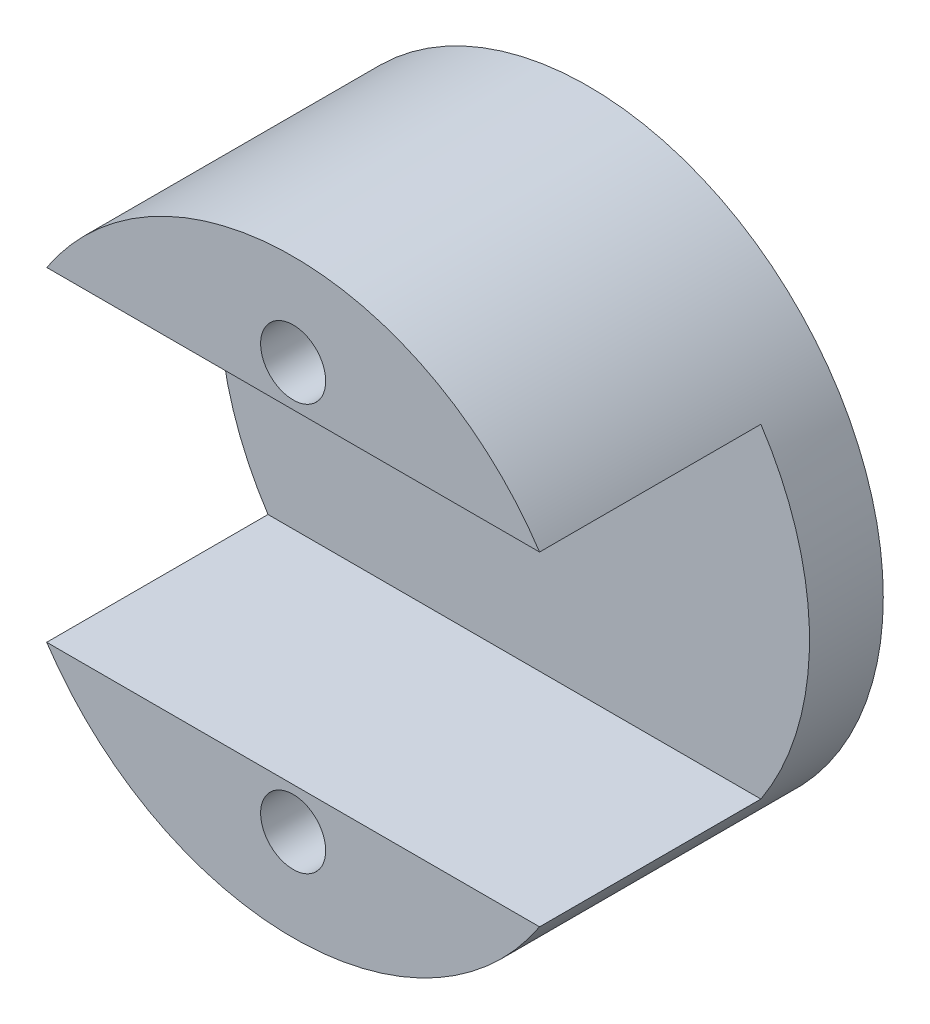
ISO-10303-21;
HEADER;
FILE_DESCRIPTION(('STEP AP214'),'2;1');
FILE_NAME('part.step','',(''),(''),'','','');
FILE_SCHEMA(('AUTOMOTIVE_DESIGN { 1 0 10303 214 1 1 1 1 }'));
ENDSEC;
DATA;
#1=APPLICATION_CONTEXT('core data for automotive mechanical design processes');
#2=APPLICATION_PROTOCOL_DEFINITION('international standard','automotive_design',2000,#1);
#3=PRODUCT_CONTEXT('',#1,'mechanical');
#4=PRODUCT('Part','Part','',(#3));
#5=PRODUCT_RELATED_PRODUCT_CATEGORY('part','',(#4));
#6=PRODUCT_DEFINITION_FORMATION('','',#4);
#7=PRODUCT_DEFINITION_CONTEXT('part definition',#1,'design');
#8=PRODUCT_DEFINITION('design','',#6,#7);
#9=PRODUCT_DEFINITION_SHAPE('','',#8);
#10=(LENGTH_UNIT() NAMED_UNIT(*) SI_UNIT(.MILLI.,.METRE.));
#11=(NAMED_UNIT(*) PLANE_ANGLE_UNIT() SI_UNIT($,.RADIAN.));
#12=(NAMED_UNIT(*) SI_UNIT($,.STERADIAN.) SOLID_ANGLE_UNIT());
#13=UNCERTAINTY_MEASURE_WITH_UNIT(LENGTH_MEASURE(1.E-05),#10,'distance_accuracy_value','');
#14=(GEOMETRIC_REPRESENTATION_CONTEXT(3) GLOBAL_UNCERTAINTY_ASSIGNED_CONTEXT((#13)) GLOBAL_UNIT_ASSIGNED_CONTEXT((#10,
#11,#12)) REPRESENTATION_CONTEXT('',''));
#15=CARTESIAN_POINT('',(0.,0.,0.));
#16=DIRECTION('',(0.,0.,1.));
#17=DIRECTION('',(1.,0.,0.));
#18=AXIS2_PLACEMENT_3D('',#15,#16,#17);
#19=CARTESIAN_POINT('',(0.,0.,25.4));
#20=DIRECTION('',(0.,0.,1.));
#21=DIRECTION('',(1.,0.,0.));
#22=AXIS2_PLACEMENT_3D('',#19,#20,#21);
#23=PLANE('',#22);
#24=CARTESIAN_POINT('',(0.,17.5,25.4));
#25=DIRECTION('',(0.,0.,1.));
#26=DIRECTION('',(1.,0.,0.));
#27=AXIS2_PLACEMENT_3D('',#24,#25,#26);
#28=CIRCLE('',#27,2.8);
#29=CARTESIAN_POINT('',(2.80000000000001,17.5,25.4));
#30=VERTEX_POINT('',#29);
#31=EDGE_CURVE('E138',#30,#30,#28,.T.);
#32=ORIENTED_EDGE('',*,*,#31,.F.);
#33=EDGE_LOOP('',(#32));
#34=FACE_BOUND('',#33,.T.);
#35=DIRECTION('',(-1.,0.,0.));
#36=VECTOR('',#35,1.);
#37=CARTESIAN_POINT('',(0.,13.97,25.4));
#38=LINE('',#37,#36);
#39=CARTESIAN_POINT('',(21.2131822223824,13.97,25.4));
#40=VERTEX_POINT('',#39);
#41=CARTESIAN_POINT('',(-21.2131822223824,13.97,25.4));
#42=VERTEX_POINT('',#41);
#43=EDGE_CURVE('E88',#40,#42,#38,.T.);
#44=ORIENTED_EDGE('',*,*,#43,.F.);
#45=CARTESIAN_POINT('',(0.,0.,25.4));
#46=DIRECTION('',(0.,0.,1.));
#47=DIRECTION('',(1.,0.,0.));
#48=AXIS2_PLACEMENT_3D('',#45,#46,#47);
#49=CIRCLE('',#48,25.4);
#50=EDGE_CURVE('E89',#40,#42,#49,.T.);
#51=ORIENTED_EDGE('',*,*,#50,.T.);
#52=EDGE_LOOP('',(#44,#51));
#53=FACE_BOUND('',#52,.T.);
#54=ADVANCED_FACE('F39',(#34,#53),#23,.T.);
#55=CARTESIAN_POINT('',(0.,0.,25.4));
#56=DIRECTION('',(0.,0.,-1.));
#57=DIRECTION('',(-1.,0.,0.));
#58=AXIS2_PLACEMENT_3D('',#55,#56,#57);
#59=CYLINDRICAL_SURFACE('',#58,25.4);
#60=CARTESIAN_POINT('',(0.,0.,6.35));
#61=DIRECTION('',(0.,0.,1.));
#62=DIRECTION('',(1.,0.,0.));
#63=AXIS2_PLACEMENT_3D('',#60,#61,#62);
#64=CIRCLE('',#63,25.4);
#65=CARTESIAN_POINT('',(-21.2131822223824,13.97,6.35));
#66=VERTEX_POINT('',#65);
#67=CARTESIAN_POINT('',(-21.2131822223824,-13.97,6.35));
#68=VERTEX_POINT('',#67);
#69=EDGE_CURVE('E11',#66,#68,#64,.T.);
#70=ORIENTED_EDGE('',*,*,#69,.F.);
#71=DIRECTION('',(0.,0.,-1.));
#72=VECTOR('',#71,1.);
#73=CARTESIAN_POINT('',(-21.2131822223824,13.97,25.4));
#74=LINE('',#73,#72);
#75=EDGE_CURVE('E63',#66,#42,#74,.F.);
#76=ORIENTED_EDGE('',*,*,#75,.T.);
#77=ORIENTED_EDGE('',*,*,#50,.F.);
#78=DIRECTION('',(0.,0.,-1.));
#79=VECTOR('',#78,1.);
#80=CARTESIAN_POINT('',(21.2131822223824,13.97,25.4));
#81=LINE('',#80,#79);
#82=CARTESIAN_POINT('',(21.2131822223824,13.97,6.35));
#83=VERTEX_POINT('',#82);
#84=EDGE_CURVE('E108',#40,#83,#81,.T.);
#85=ORIENTED_EDGE('',*,*,#84,.T.);
#86=CARTESIAN_POINT('',(21.2131822223824,-13.97,6.35));
#87=VERTEX_POINT('',#86);
#88=EDGE_CURVE('E43',#87,#83,#64,.T.);
#89=ORIENTED_EDGE('',*,*,#88,.F.);
#90=DIRECTION('',(0.,0.,-1.));
#91=VECTOR('',#90,1.);
#92=CARTESIAN_POINT('',(21.2131822223824,-13.97,25.4));
#93=LINE('',#92,#91);
#94=CARTESIAN_POINT('',(21.2131822223824,-13.97,25.4));
#95=VERTEX_POINT('',#94);
#96=EDGE_CURVE('E82',#87,#95,#93,.F.);
#97=ORIENTED_EDGE('',*,*,#96,.T.);
#98=CARTESIAN_POINT('',(-21.2131822223824,-13.97,25.4));
#99=VERTEX_POINT('',#98);
#100=EDGE_CURVE('E95',#99,#95,#49,.T.);
#101=ORIENTED_EDGE('',*,*,#100,.F.);
#102=DIRECTION('',(0.,0.,-1.));
#103=VECTOR('',#102,1.);
#104=CARTESIAN_POINT('',(-21.2131822223824,-13.97,25.4));
#105=LINE('',#104,#103);
#106=EDGE_CURVE('E55',#99,#68,#105,.T.);
#107=ORIENTED_EDGE('',*,*,#106,.T.);
#108=EDGE_LOOP('',(#70,#76,#77,#85,#89,#97,#101,#107));
#109=FACE_BOUND('',#108,.T.);
#110=CARTESIAN_POINT('',(0.,0.,0.));
#111=DIRECTION('',(0.,0.,1.));
#112=DIRECTION('',(1.,0.,0.));
#113=AXIS2_PLACEMENT_3D('',#110,#111,#112);
#114=CIRCLE('',#113,25.4);
#115=CARTESIAN_POINT('',(25.4,0.,0.));
#116=VERTEX_POINT('',#115);
#117=EDGE_CURVE('E102',#116,#116,#114,.T.);
#118=ORIENTED_EDGE('',*,*,#117,.T.);
#119=EDGE_LOOP('',(#118));
#120=FACE_BOUND('',#119,.T.);
#121=ADVANCED_FACE('F41',(#109,#120),#59,.T.);
#122=CARTESIAN_POINT('',(0.,-17.5,25.4));
#123=DIRECTION('',(0.,0.,1.));
#124=DIRECTION('',(1.,0.,0.));
#125=AXIS2_PLACEMENT_3D('',#122,#123,#124);
#126=CIRCLE('',#125,2.8);
#127=CARTESIAN_POINT('',(2.80000000000001,-17.5,25.4));
#128=VERTEX_POINT('',#127);
#129=EDGE_CURVE('E130',#128,#128,#126,.T.);
#130=ORIENTED_EDGE('',*,*,#129,.F.);
#131=EDGE_LOOP('',(#130));
#132=FACE_BOUND('',#131,.T.);
#133=DIRECTION('',(1.,0.,0.));
#134=VECTOR('',#133,1.);
#135=CARTESIAN_POINT('',(0.,-13.97,25.4));
#136=LINE('',#135,#134);
#137=EDGE_CURVE('E79',#99,#95,#136,.T.);
#138=ORIENTED_EDGE('',*,*,#137,.F.);
#139=ORIENTED_EDGE('',*,*,#100,.T.);
#140=EDGE_LOOP('',(#138,#139));
#141=FACE_BOUND('',#140,.T.);
#142=ADVANCED_FACE('F100',(#132,#141),#23,.T.);
#143=CARTESIAN_POINT('',(0.,0.,0.));
#144=DIRECTION('',(0.,0.,1.));
#145=DIRECTION('',(1.,0.,0.));
#146=AXIS2_PLACEMENT_3D('',#143,#144,#145);
#147=PLANE('',#146);
#148=CARTESIAN_POINT('',(0.,17.5,0.));
#149=DIRECTION('',(0.,0.,1.));
#150=DIRECTION('',(1.,0.,0.));
#151=AXIS2_PLACEMENT_3D('',#148,#149,#150);
#152=CIRCLE('',#151,2.8);
#153=CARTESIAN_POINT('',(2.80000000000001,17.5,0.));
#154=VERTEX_POINT('',#153);
#155=EDGE_CURVE('E129',#154,#154,#152,.T.);
#156=ORIENTED_EDGE('',*,*,#155,.T.);
#157=EDGE_LOOP('',(#156));
#158=FACE_BOUND('',#157,.T.);
#159=CARTESIAN_POINT('',(0.,-17.5,0.));
#160=DIRECTION('',(0.,0.,1.));
#161=DIRECTION('',(1.,0.,0.));
#162=AXIS2_PLACEMENT_3D('',#159,#160,#161);
#163=CIRCLE('',#162,2.8);
#164=CARTESIAN_POINT('',(2.80000000000001,-17.5,0.));
#165=VERTEX_POINT('',#164);
#166=EDGE_CURVE('E134',#165,#165,#163,.T.);
#167=ORIENTED_EDGE('',*,*,#166,.T.);
#168=EDGE_LOOP('',(#167));
#169=FACE_BOUND('',#168,.T.);
#170=ORIENTED_EDGE('',*,*,#117,.F.);
#171=EDGE_LOOP('',(#170));
#172=FACE_BOUND('',#171,.T.);
#173=ADVANCED_FACE('F146',(#158,#169,#172),#147,.F.);
#174=CARTESIAN_POINT('',(0.,0.,6.35));
#175=DIRECTION('',(0.,0.,1.));
#176=DIRECTION('',(1.,0.,0.));
#177=AXIS2_PLACEMENT_3D('',#174,#175,#176);
#178=PLANE('',#177);
#179=ORIENTED_EDGE('',*,*,#69,.T.);
#180=DIRECTION('',(1.,0.,0.));
#181=VECTOR('',#180,1.);
#182=CARTESIAN_POINT('',(-21.9458344571828,-13.97,6.35));
#183=LINE('',#182,#181);
#184=EDGE_CURVE('E117',#68,#87,#183,.T.);
#185=ORIENTED_EDGE('',*,*,#184,.T.);
#186=ORIENTED_EDGE('',*,*,#88,.T.);
#187=DIRECTION('',(-1.,0.,0.));
#188=VECTOR('',#187,1.);
#189=CARTESIAN_POINT('',(-21.9458344571828,13.97,6.35));
#190=LINE('',#189,#188);
#191=EDGE_CURVE('E98',#83,#66,#190,.T.);
#192=ORIENTED_EDGE('',*,*,#191,.T.);
#193=EDGE_LOOP('',(#179,#185,#186,#192));
#194=FACE_BOUND('',#193,.T.);
#195=ADVANCED_FACE('F116',(#194),#178,.T.);
#196=CARTESIAN_POINT('',(-21.9458344571828,13.97,6.35));
#197=DIRECTION('',(0.,1.,0.));
#198=DIRECTION('',(0.,0.,1.));
#199=AXIS2_PLACEMENT_3D('',#196,#197,#198);
#200=PLANE('',#199);
#201=ORIENTED_EDGE('',*,*,#43,.T.);
#202=ORIENTED_EDGE('',*,*,#75,.F.);
#203=ORIENTED_EDGE('',*,*,#191,.F.);
#204=ORIENTED_EDGE('',*,*,#84,.F.);
#205=EDGE_LOOP('',(#201,#202,#203,#204));
#206=FACE_BOUND('',#205,.T.);
#207=ADVANCED_FACE('F118',(#206),#200,.F.);
#208=CARTESIAN_POINT('',(-21.9458344571828,-13.97,6.35));
#209=DIRECTION('',(0.,-1.,0.));
#210=DIRECTION('',(1.,0.,0.));
#211=AXIS2_PLACEMENT_3D('',#208,#209,#210);
#212=PLANE('',#211);
#213=ORIENTED_EDGE('',*,*,#137,.T.);
#214=ORIENTED_EDGE('',*,*,#96,.F.);
#215=ORIENTED_EDGE('',*,*,#184,.F.);
#216=ORIENTED_EDGE('',*,*,#106,.F.);
#217=EDGE_LOOP('',(#213,#214,#215,#216));
#218=FACE_BOUND('',#217,.T.);
#219=ADVANCED_FACE('F81',(#218),#212,.F.);
#220=CARTESIAN_POINT('',(0.,-17.5,0.));
#221=DIRECTION('',(0.,0.,1.));
#222=DIRECTION('',(1.,0.,0.));
#223=AXIS2_PLACEMENT_3D('',#220,#221,#222);
#224=CYLINDRICAL_SURFACE('',#223,2.8);
#225=ORIENTED_EDGE('',*,*,#166,.F.);
#226=EDGE_LOOP('',(#225));
#227=FACE_BOUND('',#226,.T.);
#228=ORIENTED_EDGE('',*,*,#129,.T.);
#229=EDGE_LOOP('',(#228));
#230=FACE_BOUND('',#229,.T.);
#231=ADVANCED_FACE('F152',(#227,#230),#224,.F.);
#232=CARTESIAN_POINT('',(0.,17.5,0.));
#233=DIRECTION('',(0.,0.,1.));
#234=DIRECTION('',(1.,0.,0.));
#235=AXIS2_PLACEMENT_3D('',#232,#233,#234);
#236=CYLINDRICAL_SURFACE('',#235,2.8);
#237=ORIENTED_EDGE('',*,*,#155,.F.);
#238=EDGE_LOOP('',(#237));
#239=FACE_BOUND('',#238,.T.);
#240=ORIENTED_EDGE('',*,*,#31,.T.);
#241=EDGE_LOOP('',(#240));
#242=FACE_BOUND('',#241,.T.);
#243=ADVANCED_FACE('F149',(#239,#242),#236,.F.);
#244=CLOSED_SHELL('',(#54,#121,#142,#173,#195,#207,#219,#231,#243));
#245=MANIFOLD_SOLID_BREP('B2',#244);
#246=ADVANCED_BREP_SHAPE_REPRESENTATION('',(#18,#245),#14);
#247=SHAPE_DEFINITION_REPRESENTATION(#9,#246);
ENDSEC;
END-ISO-10303-21;
